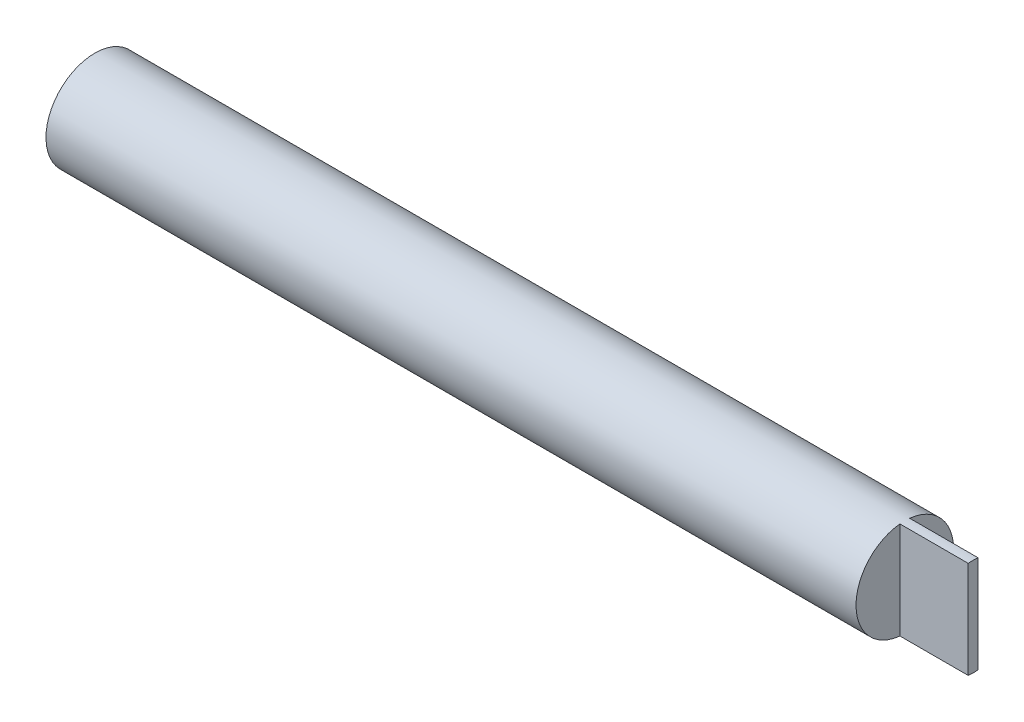
ISO-10303-21;
HEADER;
FILE_DESCRIPTION(('STEP AP214'),'2;1');
FILE_NAME('part.step','',(''),(''),'','','');
FILE_SCHEMA(('AUTOMOTIVE_DESIGN { 1 0 10303 214 1 1 1 1 }'));
ENDSEC;
DATA;
#1=APPLICATION_CONTEXT('core data for automotive mechanical design processes');
#2=APPLICATION_PROTOCOL_DEFINITION('international standard','automotive_design',2000,#1);
#3=PRODUCT_CONTEXT('',#1,'mechanical');
#4=PRODUCT('Part','Part','',(#3));
#5=PRODUCT_RELATED_PRODUCT_CATEGORY('part','',(#4));
#6=PRODUCT_DEFINITION_FORMATION('','',#4);
#7=PRODUCT_DEFINITION_CONTEXT('part definition',#1,'design');
#8=PRODUCT_DEFINITION('design','',#6,#7);
#9=PRODUCT_DEFINITION_SHAPE('','',#8);
#10=(LENGTH_UNIT() NAMED_UNIT(*) SI_UNIT(.MILLI.,.METRE.));
#11=(NAMED_UNIT(*) PLANE_ANGLE_UNIT() SI_UNIT($,.RADIAN.));
#12=(NAMED_UNIT(*) SI_UNIT($,.STERADIAN.) SOLID_ANGLE_UNIT());
#13=UNCERTAINTY_MEASURE_WITH_UNIT(LENGTH_MEASURE(1.E-05),#10,'distance_accuracy_value','');
#14=(GEOMETRIC_REPRESENTATION_CONTEXT(3) GLOBAL_UNCERTAINTY_ASSIGNED_CONTEXT((#13)) GLOBAL_UNIT_ASSIGNED_CONTEXT((#10,
#11,#12)) REPRESENTATION_CONTEXT('',''));
#15=CARTESIAN_POINT('',(0.,0.,0.));
#16=DIRECTION('',(0.,0.,1.));
#17=DIRECTION('',(1.,0.,0.));
#18=AXIS2_PLACEMENT_3D('',#15,#16,#17);
#19=CARTESIAN_POINT('',(90.,0.,0.));
#20=DIRECTION('',(-1.,0.,0.));
#21=DIRECTION('',(0.,0.,1.));
#22=AXIS2_PLACEMENT_3D('',#19,#20,#21);
#23=CYLINDRICAL_SURFACE('',#22,5.);
#24=CARTESIAN_POINT('',(90.,0.,0.));
#25=DIRECTION('',(1.,0.,0.));
#26=DIRECTION('',(0.,0.,-1.));
#27=AXIS2_PLACEMENT_3D('',#24,#25,#26);
#28=CIRCLE('',#27,5.);
#29=CARTESIAN_POINT('',(90.,-4.9749371855331,0.5));
#30=VERTEX_POINT('',#29);
#31=CARTESIAN_POINT('',(90.,-4.9749371855331,-0.5));
#32=VERTEX_POINT('',#31);
#33=EDGE_CURVE('E48',#30,#32,#28,.T.);
#34=ORIENTED_EDGE('',*,*,#33,.F.);
#35=DIRECTION('',(1.,0.,0.));
#36=VECTOR('',#35,1.);
#37=CARTESIAN_POINT('',(83.,-4.9749371855331,0.5));
#38=LINE('',#37,#36);
#39=CARTESIAN_POINT('',(83.,-4.9749371855331,0.5));
#40=VERTEX_POINT('',#39);
#41=EDGE_CURVE('E55',#40,#30,#38,.T.);
#42=ORIENTED_EDGE('',*,*,#41,.F.);
#43=CARTESIAN_POINT('',(83.,0.,0.));
#44=DIRECTION('',(1.,0.,0.));
#45=DIRECTION('',(0.,0.,-1.));
#46=AXIS2_PLACEMENT_3D('',#43,#44,#45);
#47=CIRCLE('',#46,5.);
#48=CARTESIAN_POINT('',(83.,4.9749371855331,0.5));
#49=VERTEX_POINT('',#48);
#50=EDGE_CURVE('E82',#49,#40,#47,.T.);
#51=ORIENTED_EDGE('',*,*,#50,.F.);
#52=DIRECTION('',(1.,0.,0.));
#53=VECTOR('',#52,1.);
#54=CARTESIAN_POINT('',(83.,4.9749371855331,0.5));
#55=LINE('',#54,#53);
#56=CARTESIAN_POINT('',(90.,4.9749371855331,0.5));
#57=VERTEX_POINT('',#56);
#58=EDGE_CURVE('E91',#49,#57,#55,.T.);
#59=ORIENTED_EDGE('',*,*,#58,.T.);
#60=CARTESIAN_POINT('',(90.,4.9749371855331,-0.5));
#61=VERTEX_POINT('',#60);
#62=EDGE_CURVE('E11',#61,#57,#28,.T.);
#63=ORIENTED_EDGE('',*,*,#62,.F.);
#64=DIRECTION('',(1.,0.,0.));
#65=VECTOR('',#64,1.);
#66=CARTESIAN_POINT('',(83.,4.9749371855331,-0.5));
#67=LINE('',#66,#65);
#68=CARTESIAN_POINT('',(83.,4.9749371855331,-0.5));
#69=VERTEX_POINT('',#68);
#70=EDGE_CURVE('E63',#69,#61,#67,.T.);
#71=ORIENTED_EDGE('',*,*,#70,.F.);
#72=CARTESIAN_POINT('',(83.,0.,0.));
#73=DIRECTION('',(1.,0.,0.));
#74=DIRECTION('',(0.,0.,-1.));
#75=AXIS2_PLACEMENT_3D('',#72,#73,#74);
#76=CIRCLE('',#75,5.);
#77=CARTESIAN_POINT('',(83.,-4.9749371855331,-0.5));
#78=VERTEX_POINT('',#77);
#79=EDGE_CURVE('E107',#78,#69,#76,.T.);
#80=ORIENTED_EDGE('',*,*,#79,.F.);
#81=DIRECTION('',(1.,0.,0.));
#82=VECTOR('',#81,1.);
#83=CARTESIAN_POINT('',(83.,-4.9749371855331,-0.5));
#84=LINE('',#83,#82);
#85=EDGE_CURVE('E112',#78,#32,#84,.T.);
#86=ORIENTED_EDGE('',*,*,#85,.T.);
#87=EDGE_LOOP('',(#34,#42,#51,#59,#63,#71,#80,#86));
#88=FACE_BOUND('',#87,.T.);
#89=CARTESIAN_POINT('',(0.,0.,0.));
#90=DIRECTION('',(1.,0.,0.));
#91=DIRECTION('',(0.,0.,-1.));
#92=AXIS2_PLACEMENT_3D('',#89,#90,#91);
#93=CIRCLE('',#92,5.);
#94=CARTESIAN_POINT('',(0.,0.,-5.));
#95=VERTEX_POINT('',#94);
#96=EDGE_CURVE('E42',#95,#95,#93,.T.);
#97=ORIENTED_EDGE('',*,*,#96,.T.);
#98=EDGE_LOOP('',(#97));
#99=FACE_BOUND('',#98,.T.);
#100=ADVANCED_FACE('F39',(#88,#99),#23,.T.);
#101=CARTESIAN_POINT('',(90.,0.,0.));
#102=DIRECTION('',(1.,0.,0.));
#103=DIRECTION('',(0.,0.,-1.));
#104=AXIS2_PLACEMENT_3D('',#101,#102,#103);
#105=PLANE('',#104);
#106=DIRECTION('',(0.,1.,0.));
#107=VECTOR('',#106,1.);
#108=CARTESIAN_POINT('',(90.,0.,0.5));
#109=LINE('',#108,#107);
#110=EDGE_CURVE('E88',#30,#57,#109,.T.);
#111=ORIENTED_EDGE('',*,*,#110,.F.);
#112=ORIENTED_EDGE('',*,*,#33,.T.);
#113=DIRECTION('',(0.,1.,0.));
#114=VECTOR('',#113,1.);
#115=CARTESIAN_POINT('',(90.,0.,-0.5));
#116=LINE('',#115,#114);
#117=EDGE_CURVE('E108',#32,#61,#116,.T.);
#118=ORIENTED_EDGE('',*,*,#117,.T.);
#119=ORIENTED_EDGE('',*,*,#62,.T.);
#120=EDGE_LOOP('',(#111,#112,#118,#119));
#121=FACE_BOUND('',#120,.T.);
#122=ADVANCED_FACE('F121',(#121),#105,.T.);
#123=CARTESIAN_POINT('',(0.,0.,0.));
#124=DIRECTION('',(1.,0.,0.));
#125=DIRECTION('',(0.,0.,-1.));
#126=AXIS2_PLACEMENT_3D('',#123,#124,#125);
#127=PLANE('',#126);
#128=ORIENTED_EDGE('',*,*,#96,.F.);
#129=EDGE_LOOP('',(#128));
#130=FACE_BOUND('',#129,.T.);
#131=ADVANCED_FACE('F128',(#130),#127,.F.);
#132=CARTESIAN_POINT('',(83.,0.,-0.5));
#133=DIRECTION('',(0.,0.,-1.));
#134=DIRECTION('',(-1.,0.,0.));
#135=AXIS2_PLACEMENT_3D('',#132,#133,#134);
#136=PLANE('',#135);
#137=ORIENTED_EDGE('',*,*,#117,.F.);
#138=ORIENTED_EDGE('',*,*,#85,.F.);
#139=DIRECTION('',(0.,1.,0.));
#140=VECTOR('',#139,1.);
#141=CARTESIAN_POINT('',(83.,0.,-0.5));
#142=LINE('',#141,#140);
#143=EDGE_CURVE('E104',#78,#69,#142,.T.);
#144=ORIENTED_EDGE('',*,*,#143,.T.);
#145=ORIENTED_EDGE('',*,*,#70,.T.);
#146=EDGE_LOOP('',(#137,#138,#144,#145));
#147=FACE_BOUND('',#146,.T.);
#148=ADVANCED_FACE('F130',(#147),#136,.T.);
#149=CARTESIAN_POINT('',(83.,0.,0.));
#150=DIRECTION('',(1.,0.,0.));
#151=DIRECTION('',(0.,0.,-1.));
#152=AXIS2_PLACEMENT_3D('',#149,#150,#151);
#153=PLANE('',#152);
#154=ORIENTED_EDGE('',*,*,#143,.F.);
#155=ORIENTED_EDGE('',*,*,#79,.T.);
#156=EDGE_LOOP('',(#154,#155));
#157=FACE_BOUND('',#156,.T.);
#158=ADVANCED_FACE('F135',(#157),#153,.T.);
#159=CARTESIAN_POINT('',(83.,0.,0.5));
#160=DIRECTION('',(0.,0.,-1.));
#161=DIRECTION('',(-1.,0.,0.));
#162=AXIS2_PLACEMENT_3D('',#159,#160,#161);
#163=PLANE('',#162);
#164=ORIENTED_EDGE('',*,*,#110,.T.);
#165=ORIENTED_EDGE('',*,*,#58,.F.);
#166=DIRECTION('',(0.,1.,0.));
#167=VECTOR('',#166,1.);
#168=CARTESIAN_POINT('',(83.,0.,0.5));
#169=LINE('',#168,#167);
#170=EDGE_CURVE('E84',#40,#49,#169,.T.);
#171=ORIENTED_EDGE('',*,*,#170,.F.);
#172=ORIENTED_EDGE('',*,*,#41,.T.);
#173=EDGE_LOOP('',(#164,#165,#171,#172));
#174=FACE_BOUND('',#173,.T.);
#175=ADVANCED_FACE('F90',(#174),#163,.F.);
#176=CARTESIAN_POINT('',(83.,0.,0.));
#177=DIRECTION('',(1.,0.,0.));
#178=DIRECTION('',(0.,0.,-1.));
#179=AXIS2_PLACEMENT_3D('',#176,#177,#178);
#180=PLANE('',#179);
#181=ORIENTED_EDGE('',*,*,#50,.T.);
#182=ORIENTED_EDGE('',*,*,#170,.T.);
#183=EDGE_LOOP('',(#181,#182));
#184=FACE_BOUND('',#183,.T.);
#185=ADVANCED_FACE('F83',(#184),#180,.T.);
#186=CLOSED_SHELL('',(#100,#122,#131,#148,#158,#175,#185));
#187=MANIFOLD_SOLID_BREP('B2',#186);
#188=ADVANCED_BREP_SHAPE_REPRESENTATION('',(#18,#187),#14);
#189=SHAPE_DEFINITION_REPRESENTATION(#9,#188);
ENDSEC;
END-ISO-10303-21;
